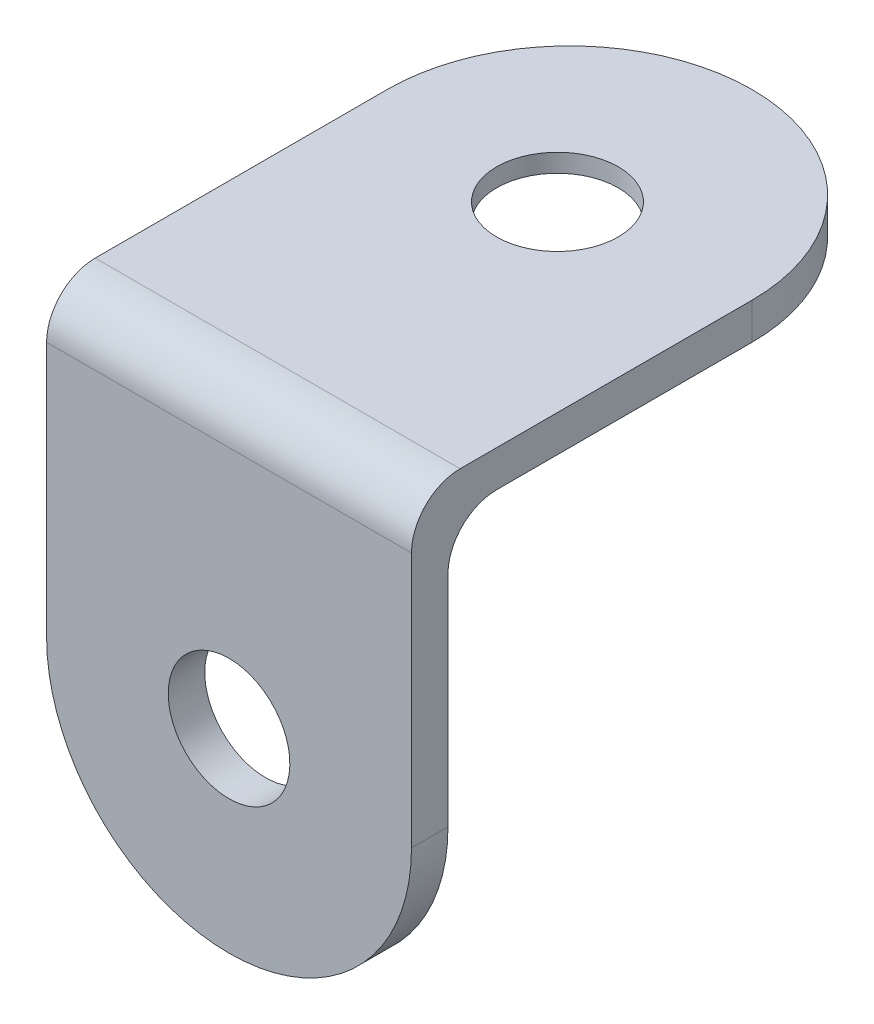
ISO-10303-21;
HEADER;
FILE_DESCRIPTION(('STEP AP214'),'2;1');
FILE_NAME('part.step','',(''),(''),'','','');
FILE_SCHEMA(('AUTOMOTIVE_DESIGN { 1 0 10303 214 1 1 1 1 }'));
ENDSEC;
DATA;
#1=APPLICATION_CONTEXT('core data for automotive mechanical design processes');
#2=APPLICATION_PROTOCOL_DEFINITION('international standard','automotive_design',2000,#1);
#3=PRODUCT_CONTEXT('',#1,'mechanical');
#4=PRODUCT('Part','Part','',(#3));
#5=PRODUCT_RELATED_PRODUCT_CATEGORY('part','',(#4));
#6=PRODUCT_DEFINITION_FORMATION('','',#4);
#7=PRODUCT_DEFINITION_CONTEXT('part definition',#1,'design');
#8=PRODUCT_DEFINITION('design','',#6,#7);
#9=PRODUCT_DEFINITION_SHAPE('','',#8);
#10=(LENGTH_UNIT() NAMED_UNIT(*) SI_UNIT(.MILLI.,.METRE.));
#11=(NAMED_UNIT(*) PLANE_ANGLE_UNIT() SI_UNIT($,.RADIAN.));
#12=(NAMED_UNIT(*) SI_UNIT($,.STERADIAN.) SOLID_ANGLE_UNIT());
#13=UNCERTAINTY_MEASURE_WITH_UNIT(LENGTH_MEASURE(1.E-05),#10,'distance_accuracy_value','');
#14=(GEOMETRIC_REPRESENTATION_CONTEXT(3) GLOBAL_UNCERTAINTY_ASSIGNED_CONTEXT((#13)) GLOBAL_UNIT_ASSIGNED_CONTEXT((#10,
#11,#12)) REPRESENTATION_CONTEXT('',''));
#15=CARTESIAN_POINT('',(0.,0.,0.));
#16=DIRECTION('',(0.,0.,1.));
#17=DIRECTION('',(1.,0.,0.));
#18=AXIS2_PLACEMENT_3D('',#15,#16,#17);
#19=CARTESIAN_POINT('',(0.,1.5,-12.));
#20=DIRECTION('',(0.,-1.,0.));
#21=DIRECTION('',(0.,0.,-1.));
#22=AXIS2_PLACEMENT_3D('',#19,#20,#21);
#23=CYLINDRICAL_SURFACE('',#22,2.5);
#24=CARTESIAN_POINT('',(0.,1.5,-12.));
#25=DIRECTION('',(0.,1.,0.));
#26=DIRECTION('',(0.,0.,1.));
#27=AXIS2_PLACEMENT_3D('',#24,#25,#26);
#28=CIRCLE('',#27,2.5);
#29=CARTESIAN_POINT('',(0.,1.5,-9.5));
#30=VERTEX_POINT('',#29);
#31=EDGE_CURVE('E127',#30,#30,#28,.T.);
#32=ORIENTED_EDGE('',*,*,#31,.T.);
#33=EDGE_LOOP('',(#32));
#34=FACE_BOUND('',#33,.T.);
#35=CARTESIAN_POINT('',(0.,0.75,-12.));
#36=DIRECTION('',(0.,-1.,0.));
#37=DIRECTION('',(0.,0.,-1.));
#38=AXIS2_PLACEMENT_3D('',#35,#36,#37);
#39=CIRCLE('',#38,2.5);
#40=CARTESIAN_POINT('',(0.,0.75,-14.5));
#41=VERTEX_POINT('',#40);
#42=EDGE_CURVE('E219',#41,#41,#39,.T.);
#43=ORIENTED_EDGE('',*,*,#42,.T.);
#44=EDGE_LOOP('',(#43));
#45=FACE_BOUND('',#44,.T.);
#46=ADVANCED_FACE('F38',(#34,#45),#23,.F.);
#47=CARTESIAN_POINT('',(0.,1.5,-12.5));
#48=DIRECTION('',(0.,1.,0.));
#49=DIRECTION('',(0.,0.,1.));
#50=AXIS2_PLACEMENT_3D('',#47,#48,#49);
#51=PLANE('',#50);
#52=DIRECTION('',(0.,0.,1.));
#53=VECTOR('',#52,1.);
#54=CARTESIAN_POINT('',(-7.5,1.5,0.));
#55=LINE('',#54,#53);
#56=CARTESIAN_POINT('',(-7.5,1.5,-12.5));
#57=VERTEX_POINT('',#56);
#58=CARTESIAN_POINT('',(-7.5,1.5,-0.499999999999994));
#59=VERTEX_POINT('',#58);
#60=EDGE_CURVE('E140',#57,#59,#55,.T.);
#61=ORIENTED_EDGE('',*,*,#60,.T.);
#62=DIRECTION('',(1.,0.,0.));
#63=VECTOR('',#62,1.);
#64=CARTESIAN_POINT('',(7.5,1.5,-0.499999999999994));
#65=LINE('',#64,#63);
#66=CARTESIAN_POINT('',(7.5,1.5,-0.499999999999994));
#67=VERTEX_POINT('',#66);
#68=EDGE_CURVE('E157',#59,#67,#65,.T.);
#69=ORIENTED_EDGE('',*,*,#68,.T.);
#70=DIRECTION('',(0.,0.,-1.));
#71=VECTOR('',#70,1.);
#72=CARTESIAN_POINT('',(7.5,1.5,0.));
#73=LINE('',#72,#71);
#74=CARTESIAN_POINT('',(7.5,1.5,-12.5));
#75=VERTEX_POINT('',#74);
#76=EDGE_CURVE('E135',#67,#75,#73,.T.);
#77=ORIENTED_EDGE('',*,*,#76,.T.);
#78=CARTESIAN_POINT('',(0.,1.5,-12.5));
#79=DIRECTION('',(0.,1.,0.));
#80=DIRECTION('',(0.,0.,1.));
#81=AXIS2_PLACEMENT_3D('',#78,#79,#80);
#82=CIRCLE('',#81,7.5);
#83=EDGE_CURVE('E137',#75,#57,#82,.T.);
#84=ORIENTED_EDGE('',*,*,#83,.T.);
#85=EDGE_LOOP('',(#61,#69,#77,#84));
#86=FACE_BOUND('',#85,.T.);
#87=ORIENTED_EDGE('',*,*,#31,.F.);
#88=EDGE_LOOP('',(#87));
#89=FACE_BOUND('',#88,.T.);
#90=ADVANCED_FACE('F185',(#86,#89),#51,.T.);
#91=CARTESIAN_POINT('',(0.,0.,-12.5));
#92=DIRECTION('',(0.,1.,0.));
#93=DIRECTION('',(0.,0.,1.));
#94=AXIS2_PLACEMENT_3D('',#91,#92,#93);
#95=PLANE('',#94);
#96=CARTESIAN_POINT('',(0.,0.,-12.));
#97=DIRECTION('',(0.,1.,0.));
#98=DIRECTION('',(0.,0.,1.));
#99=AXIS2_PLACEMENT_3D('',#96,#97,#98);
#100=CIRCLE('',#99,3.79903810567667);
#101=CARTESIAN_POINT('',(0.,0.,-8.20096189432333));
#102=VERTEX_POINT('',#101);
#103=EDGE_CURVE('E216',#102,#102,#100,.T.);
#104=ORIENTED_EDGE('',*,*,#103,.T.);
#105=EDGE_LOOP('',(#104));
#106=FACE_BOUND('',#105,.T.);
#107=DIRECTION('',(0.,0.,-1.));
#108=VECTOR('',#107,1.);
#109=CARTESIAN_POINT('',(7.5,0.,0.));
#110=LINE('',#109,#108);
#111=CARTESIAN_POINT('',(7.5,0.,-1.99999999999999));
#112=VERTEX_POINT('',#111);
#113=CARTESIAN_POINT('',(7.5,0.,-12.5));
#114=VERTEX_POINT('',#113);
#115=EDGE_CURVE('E130',#112,#114,#110,.T.);
#116=ORIENTED_EDGE('',*,*,#115,.F.);
#117=DIRECTION('',(1.,0.,0.));
#118=VECTOR('',#117,1.);
#119=CARTESIAN_POINT('',(0.,0.,-1.99999999999999));
#120=LINE('',#119,#118);
#121=CARTESIAN_POINT('',(-7.5,0.,-1.99999999999999));
#122=VERTEX_POINT('',#121);
#123=EDGE_CURVE('E155',#112,#122,#120,.F.);
#124=ORIENTED_EDGE('',*,*,#123,.T.);
#125=DIRECTION('',(0.,0.,1.));
#126=VECTOR('',#125,1.);
#127=CARTESIAN_POINT('',(-7.5,0.,0.));
#128=LINE('',#127,#126);
#129=CARTESIAN_POINT('',(-7.5,0.,-12.5));
#130=VERTEX_POINT('',#129);
#131=EDGE_CURVE('E138',#130,#122,#128,.T.);
#132=ORIENTED_EDGE('',*,*,#131,.F.);
#133=CARTESIAN_POINT('',(0.,0.,-12.5));
#134=DIRECTION('',(0.,1.,0.));
#135=DIRECTION('',(0.,0.,1.));
#136=AXIS2_PLACEMENT_3D('',#133,#134,#135);
#137=CIRCLE('',#136,7.5);
#138=EDGE_CURVE('E145',#114,#130,#137,.T.);
#139=ORIENTED_EDGE('',*,*,#138,.F.);
#140=EDGE_LOOP('',(#116,#124,#132,#139));
#141=FACE_BOUND('',#140,.T.);
#142=ADVANCED_FACE('F169',(#106,#141),#95,.F.);
#143=CARTESIAN_POINT('',(7.5,1.5,0.));
#144=DIRECTION('',(-1.,0.,0.));
#145=DIRECTION('',(0.,0.,1.));
#146=AXIS2_PLACEMENT_3D('',#143,#144,#145);
#147=PLANE('',#146);
#148=ORIENTED_EDGE('',*,*,#76,.F.);
#149=CARTESIAN_POINT('',(7.5,-0.5,-0.499999999999994));
#150=DIRECTION('',(-1.,0.,0.));
#151=DIRECTION('',(0.,0.,1.));
#152=AXIS2_PLACEMENT_3D('',#149,#150,#151);
#153=CIRCLE('',#152,2.);
#154=CARTESIAN_POINT('',(7.5,-0.499999999999993,1.50000000000001));
#155=VERTEX_POINT('',#154);
#156=EDGE_CURVE('E61',#67,#155,#153,.F.);
#157=ORIENTED_EDGE('',*,*,#156,.T.);
#158=DIRECTION('',(0.,-1.,0.));
#159=VECTOR('',#158,1.);
#160=CARTESIAN_POINT('',(7.5,1.50000000000001,1.5));
#161=LINE('',#160,#159);
#162=CARTESIAN_POINT('',(7.5,-11.,1.50000000000004));
#163=VERTEX_POINT('',#162);
#164=EDGE_CURVE('E125',#155,#163,#161,.T.);
#165=ORIENTED_EDGE('',*,*,#164,.T.);
#166=DIRECTION('',(0.,0.,1.));
#167=VECTOR('',#166,1.);
#168=CARTESIAN_POINT('',(7.5,-11.,0.));
#169=LINE('',#168,#167);
#170=CARTESIAN_POINT('',(7.5,-11.,0.));
#171=VERTEX_POINT('',#170);
#172=EDGE_CURVE('E118',#171,#163,#169,.T.);
#173=ORIENTED_EDGE('',*,*,#172,.F.);
#174=DIRECTION('',(0.,-1.,0.));
#175=VECTOR('',#174,1.);
#176=CARTESIAN_POINT('',(7.5,1.5,0.));
#177=LINE('',#176,#175);
#178=CARTESIAN_POINT('',(7.5,-1.99999999999999,0.));
#179=VERTEX_POINT('',#178);
#180=EDGE_CURVE('E103',#179,#171,#177,.T.);
#181=ORIENTED_EDGE('',*,*,#180,.F.);
#182=CARTESIAN_POINT('',(7.5,-2.,-1.99999999999999));
#183=DIRECTION('',(-1.,0.,0.));
#184=DIRECTION('',(0.,0.,1.));
#185=AXIS2_PLACEMENT_3D('',#182,#183,#184);
#186=CIRCLE('',#185,2.);
#187=EDGE_CURVE('E46',#179,#112,#186,.T.);
#188=ORIENTED_EDGE('',*,*,#187,.T.);
#189=ORIENTED_EDGE('',*,*,#115,.T.);
#190=DIRECTION('',(0.,-1.,0.));
#191=VECTOR('',#190,1.);
#192=CARTESIAN_POINT('',(7.5,1.5,-12.5));
#193=LINE('',#192,#191);
#194=EDGE_CURVE('E151',#75,#114,#193,.T.);
#195=ORIENTED_EDGE('',*,*,#194,.F.);
#196=EDGE_LOOP('',(#148,#157,#165,#173,#181,#188,#189,#195));
#197=FACE_BOUND('',#196,.T.);
#198=ADVANCED_FACE('F124',(#197),#147,.F.);
#199=CARTESIAN_POINT('',(0.,1.5,-12.5));
#200=DIRECTION('',(0.,-1.,0.));
#201=DIRECTION('',(0.,0.,-1.));
#202=AXIS2_PLACEMENT_3D('',#199,#200,#201);
#203=CYLINDRICAL_SURFACE('',#202,7.5);
#204=ORIENTED_EDGE('',*,*,#138,.T.);
#205=DIRECTION('',(0.,-1.,0.));
#206=VECTOR('',#205,1.);
#207=CARTESIAN_POINT('',(-7.5,1.5,-12.5));
#208=LINE('',#207,#206);
#209=EDGE_CURVE('E143',#57,#130,#208,.T.);
#210=ORIENTED_EDGE('',*,*,#209,.F.);
#211=ORIENTED_EDGE('',*,*,#83,.F.);
#212=ORIENTED_EDGE('',*,*,#194,.T.);
#213=EDGE_LOOP('',(#204,#210,#211,#212));
#214=FACE_BOUND('',#213,.T.);
#215=ADVANCED_FACE('F189',(#214),#203,.T.);
#216=CARTESIAN_POINT('',(-7.5,1.5,0.));
#217=DIRECTION('',(1.,0.,0.));
#218=DIRECTION('',(0.,0.,-1.));
#219=AXIS2_PLACEMENT_3D('',#216,#217,#218);
#220=PLANE('',#219);
#221=DIRECTION('',(0.,1.,0.));
#222=VECTOR('',#221,1.);
#223=CARTESIAN_POINT('',(-7.5,1.50000000000001,1.5));
#224=LINE('',#223,#222);
#225=CARTESIAN_POINT('',(-7.5,-11.,1.50000000000004));
#226=VERTEX_POINT('',#225);
#227=CARTESIAN_POINT('',(-7.5,-0.499999999999993,1.50000000000001));
#228=VERTEX_POINT('',#227);
#229=EDGE_CURVE('E113',#226,#228,#224,.T.);
#230=ORIENTED_EDGE('',*,*,#229,.T.);
#231=CARTESIAN_POINT('',(-7.5,-0.5,-0.499999999999994));
#232=DIRECTION('',(1.,0.,0.));
#233=DIRECTION('',(0.,0.,-1.));
#234=AXIS2_PLACEMENT_3D('',#231,#232,#233);
#235=CIRCLE('',#234,2.);
#236=EDGE_CURVE('E162',#228,#59,#235,.F.);
#237=ORIENTED_EDGE('',*,*,#236,.T.);
#238=ORIENTED_EDGE('',*,*,#60,.F.);
#239=ORIENTED_EDGE('',*,*,#209,.T.);
#240=ORIENTED_EDGE('',*,*,#131,.T.);
#241=CARTESIAN_POINT('',(-7.5,-2.,-1.99999999999999));
#242=DIRECTION('',(1.,0.,0.));
#243=DIRECTION('',(0.,0.,-1.));
#244=AXIS2_PLACEMENT_3D('',#241,#242,#243);
#245=CIRCLE('',#244,2.);
#246=CARTESIAN_POINT('',(-7.5,-1.99999999999999,0.));
#247=VERTEX_POINT('',#246);
#248=EDGE_CURVE('E11',#122,#247,#245,.T.);
#249=ORIENTED_EDGE('',*,*,#248,.T.);
#250=DIRECTION('',(0.,1.,0.));
#251=VECTOR('',#250,1.);
#252=CARTESIAN_POINT('',(-7.5,1.5,0.));
#253=LINE('',#252,#251);
#254=CARTESIAN_POINT('',(-7.5,-11.,0.));
#255=VERTEX_POINT('',#254);
#256=EDGE_CURVE('E122',#255,#247,#253,.T.);
#257=ORIENTED_EDGE('',*,*,#256,.F.);
#258=DIRECTION('',(0.,0.,1.));
#259=VECTOR('',#258,1.);
#260=CARTESIAN_POINT('',(-7.5,-11.,0.));
#261=LINE('',#260,#259);
#262=EDGE_CURVE('E120',#255,#226,#261,.T.);
#263=ORIENTED_EDGE('',*,*,#262,.T.);
#264=EDGE_LOOP('',(#230,#237,#238,#239,#240,#249,#257,#263));
#265=FACE_BOUND('',#264,.T.);
#266=ADVANCED_FACE('F174',(#265),#220,.F.);
#267=CARTESIAN_POINT('',(0.,-11.,0.));
#268=DIRECTION('',(0.,0.,-1.));
#269=DIRECTION('',(0.,1.,0.));
#270=AXIS2_PLACEMENT_3D('',#267,#268,#269);
#271=PLANE('',#270);
#272=ORIENTED_EDGE('',*,*,#256,.T.);
#273=DIRECTION('',(1.,0.,0.));
#274=VECTOR('',#273,1.);
#275=CARTESIAN_POINT('',(0.,-1.99999999999999,0.));
#276=LINE('',#275,#274);
#277=EDGE_CURVE('E111',#247,#179,#276,.T.);
#278=ORIENTED_EDGE('',*,*,#277,.T.);
#279=ORIENTED_EDGE('',*,*,#180,.T.);
#280=CARTESIAN_POINT('',(0.,-11.,0.));
#281=DIRECTION('',(0.,0.,-1.));
#282=DIRECTION('',(0.,1.,0.));
#283=AXIS2_PLACEMENT_3D('',#280,#281,#282);
#284=CIRCLE('',#283,7.5);
#285=EDGE_CURVE('E108',#171,#255,#284,.T.);
#286=ORIENTED_EDGE('',*,*,#285,.T.);
#287=EDGE_LOOP('',(#272,#278,#279,#286));
#288=FACE_BOUND('',#287,.T.);
#289=CARTESIAN_POINT('',(0.,-10.5,0.));
#290=DIRECTION('',(0.,0.,-1.));
#291=DIRECTION('',(0.,1.,0.));
#292=AXIS2_PLACEMENT_3D('',#289,#290,#291);
#293=CIRCLE('',#292,2.5);
#294=CARTESIAN_POINT('',(0.,-8.,0.));
#295=VERTEX_POINT('',#294);
#296=EDGE_CURVE('E179',#295,#295,#293,.T.);
#297=ORIENTED_EDGE('',*,*,#296,.F.);
#298=EDGE_LOOP('',(#297));
#299=FACE_BOUND('',#298,.T.);
#300=ADVANCED_FACE('F106',(#288,#299),#271,.T.);
#301=CARTESIAN_POINT('',(0.,-11.,1.50000000000004));
#302=DIRECTION('',(0.,0.,-1.));
#303=DIRECTION('',(0.,1.,0.));
#304=AXIS2_PLACEMENT_3D('',#301,#302,#303);
#305=PLANE('',#304);
#306=ORIENTED_EDGE('',*,*,#164,.F.);
#307=DIRECTION('',(1.,0.,0.));
#308=VECTOR('',#307,1.);
#309=CARTESIAN_POINT('',(-7.5,-0.499999999999993,1.50000000000001));
#310=LINE('',#309,#308);
#311=EDGE_CURVE('E53',#155,#228,#310,.F.);
#312=ORIENTED_EDGE('',*,*,#311,.T.);
#313=ORIENTED_EDGE('',*,*,#229,.F.);
#314=CARTESIAN_POINT('',(0.,-11.,1.50000000000004));
#315=DIRECTION('',(0.,0.,-1.));
#316=DIRECTION('',(0.,1.,0.));
#317=AXIS2_PLACEMENT_3D('',#314,#315,#316);
#318=CIRCLE('',#317,7.5);
#319=EDGE_CURVE('E178',#163,#226,#318,.T.);
#320=ORIENTED_EDGE('',*,*,#319,.F.);
#321=EDGE_LOOP('',(#306,#312,#313,#320));
#322=FACE_BOUND('',#321,.T.);
#323=CARTESIAN_POINT('',(0.,-10.5,1.50000000000004));
#324=DIRECTION('',(0.,0.,-1.));
#325=DIRECTION('',(0.,1.,0.));
#326=AXIS2_PLACEMENT_3D('',#323,#324,#325);
#327=CIRCLE('',#326,2.5);
#328=CARTESIAN_POINT('',(0.,-7.99999999999999,1.50000000000003));
#329=VERTEX_POINT('',#328);
#330=EDGE_CURVE('E218',#329,#329,#327,.T.);
#331=ORIENTED_EDGE('',*,*,#330,.T.);
#332=EDGE_LOOP('',(#331));
#333=FACE_BOUND('',#332,.T.);
#334=ADVANCED_FACE('F232',(#322,#333),#305,.F.);
#335=CARTESIAN_POINT('',(0.,-11.,0.));
#336=DIRECTION('',(0.,0.,1.));
#337=DIRECTION('',(0.,-1.,0.));
#338=AXIS2_PLACEMENT_3D('',#335,#336,#337);
#339=CYLINDRICAL_SURFACE('',#338,7.5);
#340=ORIENTED_EDGE('',*,*,#319,.T.);
#341=ORIENTED_EDGE('',*,*,#262,.F.);
#342=ORIENTED_EDGE('',*,*,#285,.F.);
#343=ORIENTED_EDGE('',*,*,#172,.T.);
#344=EDGE_LOOP('',(#340,#341,#342,#343));
#345=FACE_BOUND('',#344,.T.);
#346=ADVANCED_FACE('F117',(#345),#339,.T.);
#347=CARTESIAN_POINT('',(0.,-10.5,0.));
#348=DIRECTION('',(0.,0.,1.));
#349=DIRECTION('',(0.,-1.,0.));
#350=AXIS2_PLACEMENT_3D('',#347,#348,#349);
#351=CYLINDRICAL_SURFACE('',#350,2.5);
#352=ORIENTED_EDGE('',*,*,#296,.T.);
#353=EDGE_LOOP('',(#352));
#354=FACE_BOUND('',#353,.T.);
#355=ORIENTED_EDGE('',*,*,#330,.F.);
#356=EDGE_LOOP('',(#355));
#357=FACE_BOUND('',#356,.T.);
#358=ADVANCED_FACE('F229',(#354,#357),#351,.F.);
#359=CARTESIAN_POINT('',(0.,-2.,-1.99999999999999));
#360=DIRECTION('',(1.,0.,0.));
#361=DIRECTION('',(0.,0.,-1.));
#362=AXIS2_PLACEMENT_3D('',#359,#360,#361);
#363=CYLINDRICAL_SURFACE('',#362,2.);
#364=ORIENTED_EDGE('',*,*,#248,.F.);
#365=ORIENTED_EDGE('',*,*,#123,.F.);
#366=ORIENTED_EDGE('',*,*,#187,.F.);
#367=ORIENTED_EDGE('',*,*,#277,.F.);
#368=EDGE_LOOP('',(#364,#365,#366,#367));
#369=FACE_BOUND('',#368,.T.);
#370=ADVANCED_FACE('F172',(#369),#363,.F.);
#371=CARTESIAN_POINT('',(0.,-0.5,-0.499999999999994));
#372=DIRECTION('',(-1.,0.,0.));
#373=DIRECTION('',(0.,0.,1.));
#374=AXIS2_PLACEMENT_3D('',#371,#372,#373);
#375=CYLINDRICAL_SURFACE('',#374,2.);
#376=ORIENTED_EDGE('',*,*,#236,.F.);
#377=ORIENTED_EDGE('',*,*,#311,.F.);
#378=ORIENTED_EDGE('',*,*,#156,.F.);
#379=ORIENTED_EDGE('',*,*,#68,.F.);
#380=EDGE_LOOP('',(#376,#377,#378,#379));
#381=FACE_BOUND('',#380,.T.);
#382=ADVANCED_FACE('F40',(#381),#375,.T.);
#383=CARTESIAN_POINT('',(0.,0.75,-12.));
#384=DIRECTION('',(0.,-1.,0.));
#385=DIRECTION('',(0.,0.,-1.));
#386=AXIS2_PLACEMENT_3D('',#383,#384,#385);
#387=CONICAL_SURFACE('',#386,2.5,1.0471975511966);
#388=ORIENTED_EDGE('',*,*,#103,.F.);
#389=EDGE_LOOP('',(#388));
#390=FACE_BOUND('',#389,.T.);
#391=ORIENTED_EDGE('',*,*,#42,.F.);
#392=EDGE_LOOP('',(#391));
#393=FACE_BOUND('',#392,.T.);
#394=ADVANCED_FACE('F240',(#390,#393),#387,.F.);
#395=CLOSED_SHELL('',(#46,#90,#142,#198,#215,#266,#300,#334,#346,#358,#370,#382,#394));
#396=MANIFOLD_SOLID_BREP('B2',#395);
#397=ADVANCED_BREP_SHAPE_REPRESENTATION('',(#18,#396),#14);
#398=SHAPE_DEFINITION_REPRESENTATION(#9,#397);
ENDSEC;
END-ISO-10303-21;
